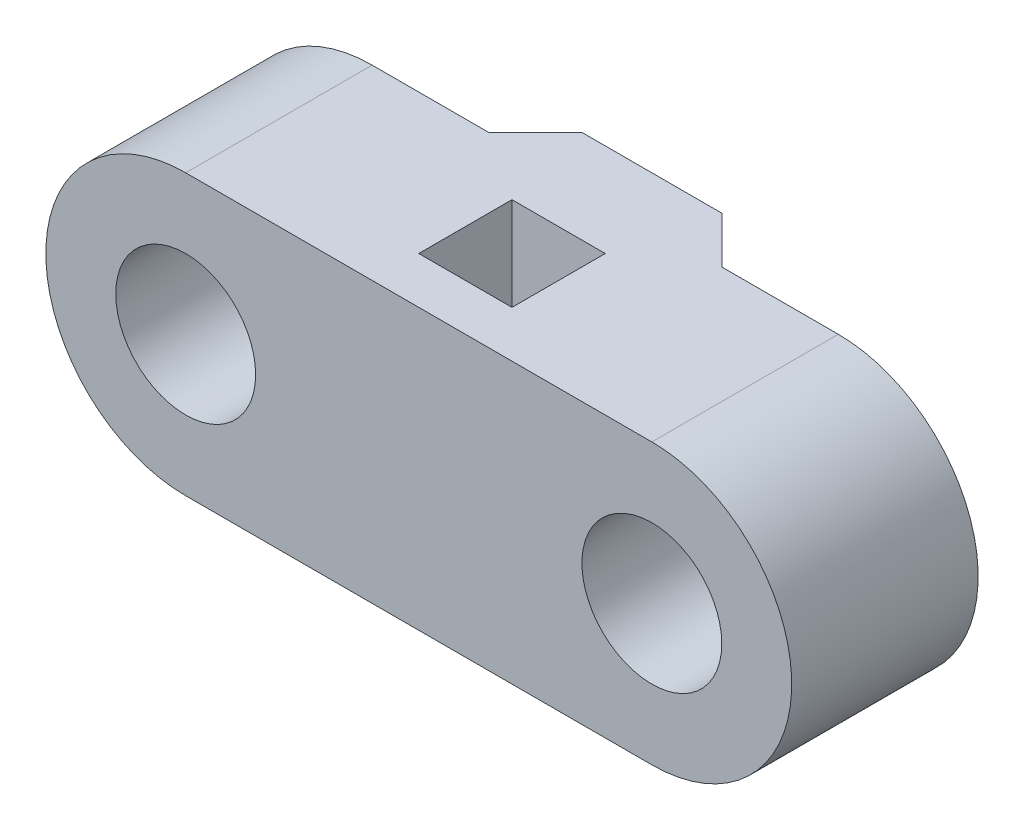
ISO-10303-21;
HEADER;
FILE_DESCRIPTION(('STEP AP214'),'2;1');
FILE_NAME('part.step','',(''),(''),'','','');
FILE_SCHEMA(('AUTOMOTIVE_DESIGN { 1 0 10303 214 1 1 1 1 }'));
ENDSEC;
DATA;
#1=APPLICATION_CONTEXT('core data for automotive mechanical design processes');
#2=APPLICATION_PROTOCOL_DEFINITION('international standard','automotive_design',2000,#1);
#3=PRODUCT_CONTEXT('',#1,'mechanical');
#4=PRODUCT('Part','Part','',(#3));
#5=PRODUCT_RELATED_PRODUCT_CATEGORY('part','',(#4));
#6=PRODUCT_DEFINITION_FORMATION('','',#4);
#7=PRODUCT_DEFINITION_CONTEXT('part definition',#1,'design');
#8=PRODUCT_DEFINITION('design','',#6,#7);
#9=PRODUCT_DEFINITION_SHAPE('','',#8);
#10=(LENGTH_UNIT() NAMED_UNIT(*) SI_UNIT(.MILLI.,.METRE.));
#11=(NAMED_UNIT(*) PLANE_ANGLE_UNIT() SI_UNIT($,.RADIAN.));
#12=(NAMED_UNIT(*) SI_UNIT($,.STERADIAN.) SOLID_ANGLE_UNIT());
#13=UNCERTAINTY_MEASURE_WITH_UNIT(LENGTH_MEASURE(1.E-05),#10,'distance_accuracy_value','');
#14=(GEOMETRIC_REPRESENTATION_CONTEXT(3) GLOBAL_UNCERTAINTY_ASSIGNED_CONTEXT((#13)) GLOBAL_UNIT_ASSIGNED_CONTEXT((#10,
#11,#12)) REPRESENTATION_CONTEXT('',''));
#15=CARTESIAN_POINT('',(0.,0.,0.));
#16=DIRECTION('',(0.,0.,1.));
#17=DIRECTION('',(1.,0.,0.));
#18=AXIS2_PLACEMENT_3D('',#15,#16,#17);
#19=CARTESIAN_POINT('',(0.,0.,0.));
#20=DIRECTION('',(0.,1.,0.));
#21=DIRECTION('',(0.,0.,1.));
#22=AXIS2_PLACEMENT_3D('',#19,#20,#21);
#23=PLANE('',#22);
#24=DIRECTION('',(0.,0.,1.));
#25=VECTOR('',#24,1.);
#26=CARTESIAN_POINT('',(-10.,0.,10.));
#27=LINE('',#26,#25);
#28=CARTESIAN_POINT('',(-10.,0.,-10.));
#29=VERTEX_POINT('',#28);
#30=CARTESIAN_POINT('',(-10.,0.,10.));
#31=VERTEX_POINT('',#30);
#32=EDGE_CURVE('E202',#29,#31,#27,.T.);
#33=ORIENTED_EDGE('',*,*,#32,.T.);
#34=DIRECTION('',(1.,0.,0.));
#35=VECTOR('',#34,1.);
#36=CARTESIAN_POINT('',(10.,0.,9.99999999999999));
#37=LINE('',#36,#35);
#38=CARTESIAN_POINT('',(10.,0.,9.99999999999999));
#39=VERTEX_POINT('',#38);
#40=EDGE_CURVE('E220',#31,#39,#37,.T.);
#41=ORIENTED_EDGE('',*,*,#40,.T.);
#42=DIRECTION('',(0.,0.,-1.));
#43=VECTOR('',#42,1.);
#44=CARTESIAN_POINT('',(10.,0.,9.99999999999999));
#45=LINE('',#44,#43);
#46=CARTESIAN_POINT('',(10.,0.,-10.));
#47=VERTEX_POINT('',#46);
#48=EDGE_CURVE('E223',#39,#47,#45,.T.);
#49=ORIENTED_EDGE('',*,*,#48,.T.);
#50=DIRECTION('',(-1.,0.,0.));
#51=VECTOR('',#50,1.);
#52=CARTESIAN_POINT('',(10.,0.,-10.));
#53=LINE('',#52,#51);
#54=EDGE_CURVE('E210',#47,#29,#53,.T.);
#55=ORIENTED_EDGE('',*,*,#54,.T.);
#56=EDGE_LOOP('',(#33,#41,#49,#55));
#57=FACE_BOUND('',#56,.T.);
#58=DIRECTION('',(0.,0.,1.));
#59=VECTOR('',#58,1.);
#60=CARTESIAN_POINT('',(50.,0.,-30.));
#61=LINE('',#60,#59);
#62=CARTESIAN_POINT('',(50.,0.,-20.));
#63=VERTEX_POINT('',#62);
#64=CARTESIAN_POINT('',(50.,0.,20.));
#65=VERTEX_POINT('',#64);
#66=EDGE_CURVE('E245',#63,#65,#61,.T.);
#67=ORIENTED_EDGE('',*,*,#66,.T.);
#68=DIRECTION('',(1.,0.,0.));
#69=VECTOR('',#68,1.);
#70=CARTESIAN_POINT('',(-80.,0.,20.));
#71=LINE('',#70,#69);
#72=CARTESIAN_POINT('',(-50.,0.,20.));
#73=VERTEX_POINT('',#72);
#74=EDGE_CURVE('E166',#73,#65,#71,.T.);
#75=ORIENTED_EDGE('',*,*,#74,.F.);
#76=DIRECTION('',(0.,0.,1.));
#77=VECTOR('',#76,1.);
#78=CARTESIAN_POINT('',(-50.,0.,-30.));
#79=LINE('',#78,#77);
#80=CARTESIAN_POINT('',(-50.,0.,-20.));
#81=VERTEX_POINT('',#80);
#82=EDGE_CURVE('E132',#81,#73,#79,.T.);
#83=ORIENTED_EDGE('',*,*,#82,.F.);
#84=DIRECTION('',(-1.,0.,0.));
#85=VECTOR('',#84,1.);
#86=CARTESIAN_POINT('',(-15.,0.,-20.));
#87=LINE('',#86,#85);
#88=CARTESIAN_POINT('',(-25.,0.,-20.));
#89=VERTEX_POINT('',#88);
#90=EDGE_CURVE('E163',#89,#81,#87,.T.);
#91=ORIENTED_EDGE('',*,*,#90,.F.);
#92=DIRECTION('',(-0.707106781186546,0.,0.707106781186549));
#93=VECTOR('',#92,1.);
#94=CARTESIAN_POINT('',(-22.5,0.,-22.4999999999999));
#95=LINE('',#94,#93);
#96=CARTESIAN_POINT('',(-15.,0.,-30.));
#97=VERTEX_POINT('',#96);
#98=EDGE_CURVE('E47',#89,#97,#95,.F.);
#99=ORIENTED_EDGE('',*,*,#98,.T.);
#100=DIRECTION('',(-1.,0.,0.));
#101=VECTOR('',#100,1.);
#102=CARTESIAN_POINT('',(-15.,0.,-30.));
#103=LINE('',#102,#101);
#104=CARTESIAN_POINT('',(15.,0.,-30.));
#105=VERTEX_POINT('',#104);
#106=EDGE_CURVE('E160',#105,#97,#103,.T.);
#107=ORIENTED_EDGE('',*,*,#106,.F.);
#108=DIRECTION('',(-0.707106781186547,0.,-0.707106781186549));
#109=VECTOR('',#108,1.);
#110=CARTESIAN_POINT('',(22.5,0.,-22.5));
#111=LINE('',#110,#109);
#112=CARTESIAN_POINT('',(25.,0.,-20.));
#113=VERTEX_POINT('',#112);
#114=EDGE_CURVE('E184',#105,#113,#111,.F.);
#115=ORIENTED_EDGE('',*,*,#114,.T.);
#116=DIRECTION('',(-1.,0.,0.));
#117=VECTOR('',#116,1.);
#118=CARTESIAN_POINT('',(15.,0.,-20.));
#119=LINE('',#118,#117);
#120=EDGE_CURVE('E168',#63,#113,#119,.T.);
#121=ORIENTED_EDGE('',*,*,#120,.F.);
#122=EDGE_LOOP('',(#67,#75,#83,#91,#99,#107,#115,#121));
#123=FACE_BOUND('',#122,.T.);
#124=ADVANCED_FACE('F38',(#57,#123),#23,.F.);
#125=CARTESIAN_POINT('',(-15.,60.,-20.));
#126=DIRECTION('',(0.,0.,1.));
#127=DIRECTION('',(1.,0.,0.));
#128=AXIS2_PLACEMENT_3D('',#125,#126,#127);
#129=PLANE('',#128);
#130=DIRECTION('',(-1.,0.,0.));
#131=VECTOR('',#130,1.);
#132=CARTESIAN_POINT('',(-15.,60.,-20.));
#133=LINE('',#132,#131);
#134=CARTESIAN_POINT('',(-25.,60.,-20.));
#135=VERTEX_POINT('',#134);
#136=CARTESIAN_POINT('',(-50.,60.,-20.));
#137=VERTEX_POINT('',#136);
#138=EDGE_CURVE('E145',#135,#137,#133,.T.);
#139=ORIENTED_EDGE('',*,*,#138,.F.);
#140=DIRECTION('',(0.,-1.,0.));
#141=VECTOR('',#140,1.);
#142=CARTESIAN_POINT('',(-25.,0.,-20.));
#143=LINE('',#142,#141);
#144=EDGE_CURVE('E182',#135,#89,#143,.T.);
#145=ORIENTED_EDGE('',*,*,#144,.T.);
#146=ORIENTED_EDGE('',*,*,#90,.T.);
#147=CARTESIAN_POINT('',(-50.,30.,-20.));
#148=DIRECTION('',(0.,0.,1.));
#149=DIRECTION('',(1.,0.,0.));
#150=AXIS2_PLACEMENT_3D('',#147,#148,#149);
#151=CIRCLE('',#150,30.);
#152=EDGE_CURVE('E178',#81,#137,#151,.F.);
#153=ORIENTED_EDGE('',*,*,#152,.T.);
#154=EDGE_LOOP('',(#139,#145,#146,#153));
#155=FACE_BOUND('',#154,.T.);
#156=CARTESIAN_POINT('',(-50.,30.,-20.));
#157=DIRECTION('',(0.,0.,1.));
#158=DIRECTION('',(1.,0.,0.));
#159=AXIS2_PLACEMENT_3D('',#156,#157,#158);
#160=CIRCLE('',#159,15.);
#161=CARTESIAN_POINT('',(-35.,30.,-20.));
#162=VERTEX_POINT('',#161);
#163=EDGE_CURVE('E199',#162,#162,#160,.T.);
#164=ORIENTED_EDGE('',*,*,#163,.T.);
#165=EDGE_LOOP('',(#164));
#166=FACE_BOUND('',#165,.T.);
#167=ADVANCED_FACE('F197',(#155,#166),#129,.F.);
#168=CARTESIAN_POINT('',(0.,60.,0.));
#169=DIRECTION('',(0.,1.,0.));
#170=DIRECTION('',(0.,0.,1.));
#171=AXIS2_PLACEMENT_3D('',#168,#169,#170);
#172=PLANE('',#171);
#173=DIRECTION('',(0.,0.,1.));
#174=VECTOR('',#173,1.);
#175=CARTESIAN_POINT('',(50.,60.,-30.));
#176=LINE('',#175,#174);
#177=CARTESIAN_POINT('',(50.,60.,-20.));
#178=VERTEX_POINT('',#177);
#179=CARTESIAN_POINT('',(50.,60.,20.));
#180=VERTEX_POINT('',#179);
#181=EDGE_CURVE('E248',#178,#180,#176,.T.);
#182=ORIENTED_EDGE('',*,*,#181,.F.);
#183=DIRECTION('',(-1.,0.,0.));
#184=VECTOR('',#183,1.);
#185=CARTESIAN_POINT('',(15.,60.,-20.));
#186=LINE('',#185,#184);
#187=CARTESIAN_POINT('',(25.,60.,-20.));
#188=VERTEX_POINT('',#187);
#189=EDGE_CURVE('E151',#178,#188,#186,.T.);
#190=ORIENTED_EDGE('',*,*,#189,.T.);
#191=DIRECTION('',(0.707106781186547,0.,0.707106781186549));
#192=VECTOR('',#191,1.);
#193=CARTESIAN_POINT('',(15.,60.,-30.));
#194=LINE('',#193,#192);
#195=CARTESIAN_POINT('',(15.,60.,-30.));
#196=VERTEX_POINT('',#195);
#197=EDGE_CURVE('E186',#188,#196,#194,.F.);
#198=ORIENTED_EDGE('',*,*,#197,.T.);
#199=DIRECTION('',(-1.,0.,0.));
#200=VECTOR('',#199,1.);
#201=CARTESIAN_POINT('',(-15.,60.,-30.));
#202=LINE('',#201,#200);
#203=CARTESIAN_POINT('',(-15.,60.,-30.));
#204=VERTEX_POINT('',#203);
#205=EDGE_CURVE('E156',#196,#204,#202,.T.);
#206=ORIENTED_EDGE('',*,*,#205,.T.);
#207=DIRECTION('',(0.707106781186546,0.,-0.707106781186549));
#208=VECTOR('',#207,1.);
#209=CARTESIAN_POINT('',(-25.,60.,-20.));
#210=LINE('',#209,#208);
#211=EDGE_CURVE('E11',#204,#135,#210,.F.);
#212=ORIENTED_EDGE('',*,*,#211,.T.);
#213=ORIENTED_EDGE('',*,*,#138,.T.);
#214=DIRECTION('',(0.,0.,1.));
#215=VECTOR('',#214,1.);
#216=CARTESIAN_POINT('',(-50.,60.,-30.));
#217=LINE('',#216,#215);
#218=CARTESIAN_POINT('',(-50.,60.,20.));
#219=VERTEX_POINT('',#218);
#220=EDGE_CURVE('E130',#137,#219,#217,.T.);
#221=ORIENTED_EDGE('',*,*,#220,.T.);
#222=DIRECTION('',(1.,0.,0.));
#223=VECTOR('',#222,1.);
#224=CARTESIAN_POINT('',(-80.,60.,20.));
#225=LINE('',#224,#223);
#226=EDGE_CURVE('E144',#219,#180,#225,.T.);
#227=ORIENTED_EDGE('',*,*,#226,.T.);
#228=EDGE_LOOP('',(#182,#190,#198,#206,#212,#213,#221,#227));
#229=FACE_BOUND('',#228,.T.);
#230=DIRECTION('',(1.,0.,0.));
#231=VECTOR('',#230,1.);
#232=CARTESIAN_POINT('',(10.,60.,9.99999999999999));
#233=LINE('',#232,#231);
#234=CARTESIAN_POINT('',(-10.,60.,10.));
#235=VERTEX_POINT('',#234);
#236=CARTESIAN_POINT('',(10.,60.,9.99999999999999));
#237=VERTEX_POINT('',#236);
#238=EDGE_CURVE('E209',#235,#237,#233,.T.);
#239=ORIENTED_EDGE('',*,*,#238,.F.);
#240=DIRECTION('',(0.,0.,1.));
#241=VECTOR('',#240,1.);
#242=CARTESIAN_POINT('',(-10.,60.,10.));
#243=LINE('',#242,#241);
#244=CARTESIAN_POINT('',(-10.,60.,-10.));
#245=VERTEX_POINT('',#244);
#246=EDGE_CURVE('E207',#245,#235,#243,.T.);
#247=ORIENTED_EDGE('',*,*,#246,.F.);
#248=DIRECTION('',(-1.,0.,0.));
#249=VECTOR('',#248,1.);
#250=CARTESIAN_POINT('',(10.,60.,-10.));
#251=LINE('',#250,#249);
#252=CARTESIAN_POINT('',(10.,60.,-10.));
#253=VERTEX_POINT('',#252);
#254=EDGE_CURVE('E215',#253,#245,#251,.T.);
#255=ORIENTED_EDGE('',*,*,#254,.F.);
#256=DIRECTION('',(0.,0.,-1.));
#257=VECTOR('',#256,1.);
#258=CARTESIAN_POINT('',(10.,60.,9.99999999999999));
#259=LINE('',#258,#257);
#260=EDGE_CURVE('E212',#237,#253,#259,.T.);
#261=ORIENTED_EDGE('',*,*,#260,.F.);
#262=EDGE_LOOP('',(#239,#247,#255,#261));
#263=FACE_BOUND('',#262,.T.);
#264=ADVANCED_FACE('F142',(#229,#263),#172,.T.);
#265=CARTESIAN_POINT('',(-15.,60.,-30.));
#266=DIRECTION('',(0.,0.,1.));
#267=DIRECTION('',(1.,0.,0.));
#268=AXIS2_PLACEMENT_3D('',#265,#266,#267);
#269=PLANE('',#268);
#270=ORIENTED_EDGE('',*,*,#106,.T.);
#271=DIRECTION('',(0.,-1.,0.));
#272=VECTOR('',#271,1.);
#273=CARTESIAN_POINT('',(-15.,60.,-30.));
#274=LINE('',#273,#272);
#275=EDGE_CURVE('E154',#204,#97,#274,.T.);
#276=ORIENTED_EDGE('',*,*,#275,.F.);
#277=ORIENTED_EDGE('',*,*,#205,.F.);
#278=DIRECTION('',(0.,-1.,0.));
#279=VECTOR('',#278,1.);
#280=CARTESIAN_POINT('',(15.,60.,-30.));
#281=LINE('',#280,#279);
#282=EDGE_CURVE('E172',#196,#105,#281,.T.);
#283=ORIENTED_EDGE('',*,*,#282,.T.);
#284=EDGE_LOOP('',(#270,#276,#277,#283));
#285=FACE_BOUND('',#284,.T.);
#286=ADVANCED_FACE('F193',(#285),#269,.F.);
#287=CARTESIAN_POINT('',(-80.,60.,20.));
#288=DIRECTION('',(0.,0.,-1.));
#289=DIRECTION('',(-1.,0.,0.));
#290=AXIS2_PLACEMENT_3D('',#287,#288,#289);
#291=PLANE('',#290);
#292=CARTESIAN_POINT('',(-50.,30.,20.));
#293=DIRECTION('',(0.,0.,1.));
#294=DIRECTION('',(-1.,0.,0.));
#295=AXIS2_PLACEMENT_3D('',#292,#293,#294);
#296=CIRCLE('',#295,15.);
#297=CARTESIAN_POINT('',(-65.,30.,20.));
#298=VERTEX_POINT('',#297);
#299=EDGE_CURVE('E247',#298,#298,#296,.T.);
#300=ORIENTED_EDGE('',*,*,#299,.F.);
#301=EDGE_LOOP('',(#300));
#302=FACE_BOUND('',#301,.T.);
#303=CARTESIAN_POINT('',(50.,30.,20.));
#304=DIRECTION('',(0.,0.,1.));
#305=DIRECTION('',(1.,0.,0.));
#306=AXIS2_PLACEMENT_3D('',#303,#304,#305);
#307=CIRCLE('',#306,15.);
#308=CARTESIAN_POINT('',(65.,30.,20.));
#309=VERTEX_POINT('',#308);
#310=EDGE_CURVE('E179',#309,#309,#307,.T.);
#311=ORIENTED_EDGE('',*,*,#310,.F.);
#312=EDGE_LOOP('',(#311));
#313=FACE_BOUND('',#312,.T.);
#314=ORIENTED_EDGE('',*,*,#74,.T.);
#315=CARTESIAN_POINT('',(50.,30.,20.));
#316=DIRECTION('',(0.,0.,-1.));
#317=DIRECTION('',(-1.,0.,0.));
#318=AXIS2_PLACEMENT_3D('',#315,#316,#317);
#319=CIRCLE('',#318,30.);
#320=EDGE_CURVE('E149',#180,#65,#319,.T.);
#321=ORIENTED_EDGE('',*,*,#320,.F.);
#322=ORIENTED_EDGE('',*,*,#226,.F.);
#323=CARTESIAN_POINT('',(-50.,30.,20.));
#324=DIRECTION('',(0.,0.,-1.));
#325=DIRECTION('',(-1.,0.,0.));
#326=AXIS2_PLACEMENT_3D('',#323,#324,#325);
#327=CIRCLE('',#326,30.);
#328=EDGE_CURVE('E126',#219,#73,#327,.F.);
#329=ORIENTED_EDGE('',*,*,#328,.T.);
#330=EDGE_LOOP('',(#314,#321,#322,#329));
#331=FACE_BOUND('',#330,.T.);
#332=ADVANCED_FACE('F148',(#302,#313,#331),#291,.F.);
#333=CARTESIAN_POINT('',(15.,60.,-20.));
#334=DIRECTION('',(0.,0.,1.));
#335=DIRECTION('',(1.,0.,0.));
#336=AXIS2_PLACEMENT_3D('',#333,#334,#335);
#337=PLANE('',#336);
#338=CARTESIAN_POINT('',(50.,30.,-20.));
#339=DIRECTION('',(0.,0.,1.));
#340=DIRECTION('',(1.,0.,0.));
#341=AXIS2_PLACEMENT_3D('',#338,#339,#340);
#342=CIRCLE('',#341,15.);
#343=CARTESIAN_POINT('',(65.,30.,-20.));
#344=VERTEX_POINT('',#343);
#345=EDGE_CURVE('E175',#344,#344,#342,.T.);
#346=ORIENTED_EDGE('',*,*,#345,.T.);
#347=EDGE_LOOP('',(#346));
#348=FACE_BOUND('',#347,.T.);
#349=ORIENTED_EDGE('',*,*,#120,.T.);
#350=DIRECTION('',(0.,1.,0.));
#351=VECTOR('',#350,1.);
#352=CARTESIAN_POINT('',(25.,60.,-20.));
#353=LINE('',#352,#351);
#354=EDGE_CURVE('E137',#113,#188,#353,.T.);
#355=ORIENTED_EDGE('',*,*,#354,.T.);
#356=ORIENTED_EDGE('',*,*,#189,.F.);
#357=CARTESIAN_POINT('',(50.,30.,-20.));
#358=DIRECTION('',(0.,0.,1.));
#359=DIRECTION('',(1.,0.,0.));
#360=AXIS2_PLACEMENT_3D('',#357,#358,#359);
#361=CIRCLE('',#360,30.);
#362=EDGE_CURVE('E138',#178,#63,#361,.F.);
#363=ORIENTED_EDGE('',*,*,#362,.T.);
#364=EDGE_LOOP('',(#349,#355,#356,#363));
#365=FACE_BOUND('',#364,.T.);
#366=ADVANCED_FACE('F241',(#348,#365),#337,.F.);
#367=CARTESIAN_POINT('',(-10.,60.,10.));
#368=DIRECTION('',(1.,0.,0.));
#369=DIRECTION('',(0.,0.,-1.));
#370=AXIS2_PLACEMENT_3D('',#367,#368,#369);
#371=PLANE('',#370);
#372=ORIENTED_EDGE('',*,*,#32,.F.);
#373=DIRECTION('',(0.,-1.,0.));
#374=VECTOR('',#373,1.);
#375=CARTESIAN_POINT('',(-10.,60.,-10.));
#376=LINE('',#375,#374);
#377=EDGE_CURVE('E217',#245,#29,#376,.T.);
#378=ORIENTED_EDGE('',*,*,#377,.F.);
#379=ORIENTED_EDGE('',*,*,#246,.T.);
#380=DIRECTION('',(0.,-1.,0.));
#381=VECTOR('',#380,1.);
#382=CARTESIAN_POINT('',(-10.,60.,10.));
#383=LINE('',#382,#381);
#384=EDGE_CURVE('E164',#235,#31,#383,.T.);
#385=ORIENTED_EDGE('',*,*,#384,.T.);
#386=EDGE_LOOP('',(#372,#378,#379,#385));
#387=FACE_BOUND('',#386,.T.);
#388=ADVANCED_FACE('F269',(#387),#371,.T.);
#389=CARTESIAN_POINT('',(10.,60.,9.99999999999999));
#390=DIRECTION('',(0.,0.,-1.));
#391=DIRECTION('',(-1.,0.,0.));
#392=AXIS2_PLACEMENT_3D('',#389,#390,#391);
#393=PLANE('',#392);
#394=ORIENTED_EDGE('',*,*,#40,.F.);
#395=ORIENTED_EDGE('',*,*,#384,.F.);
#396=ORIENTED_EDGE('',*,*,#238,.T.);
#397=DIRECTION('',(0.,-1.,0.));
#398=VECTOR('',#397,1.);
#399=CARTESIAN_POINT('',(10.,60.,9.99999999999999));
#400=LINE('',#399,#398);
#401=EDGE_CURVE('E232',#237,#39,#400,.T.);
#402=ORIENTED_EDGE('',*,*,#401,.T.);
#403=EDGE_LOOP('',(#394,#395,#396,#402));
#404=FACE_BOUND('',#403,.T.);
#405=ADVANCED_FACE('F285',(#404),#393,.T.);
#406=CARTESIAN_POINT('',(10.,60.,9.99999999999999));
#407=DIRECTION('',(-1.,0.,0.));
#408=DIRECTION('',(0.,0.,1.));
#409=AXIS2_PLACEMENT_3D('',#406,#407,#408);
#410=PLANE('',#409);
#411=ORIENTED_EDGE('',*,*,#48,.F.);
#412=ORIENTED_EDGE('',*,*,#401,.F.);
#413=ORIENTED_EDGE('',*,*,#260,.T.);
#414=DIRECTION('',(0.,-1.,0.));
#415=VECTOR('',#414,1.);
#416=CARTESIAN_POINT('',(10.,60.,-10.));
#417=LINE('',#416,#415);
#418=EDGE_CURVE('E230',#253,#47,#417,.T.);
#419=ORIENTED_EDGE('',*,*,#418,.T.);
#420=EDGE_LOOP('',(#411,#412,#413,#419));
#421=FACE_BOUND('',#420,.T.);
#422=ADVANCED_FACE('F289',(#421),#410,.T.);
#423=CARTESIAN_POINT('',(10.,60.,-10.));
#424=DIRECTION('',(0.,0.,1.));
#425=DIRECTION('',(1.,0.,0.));
#426=AXIS2_PLACEMENT_3D('',#423,#424,#425);
#427=PLANE('',#426);
#428=ORIENTED_EDGE('',*,*,#54,.F.);
#429=ORIENTED_EDGE('',*,*,#418,.F.);
#430=ORIENTED_EDGE('',*,*,#254,.T.);
#431=ORIENTED_EDGE('',*,*,#377,.T.);
#432=EDGE_LOOP('',(#428,#429,#430,#431));
#433=FACE_BOUND('',#432,.T.);
#434=ADVANCED_FACE('F293',(#433),#427,.T.);
#435=CARTESIAN_POINT('',(50.,30.,-30.));
#436=DIRECTION('',(0.,0.,1.));
#437=DIRECTION('',(1.,0.,0.));
#438=AXIS2_PLACEMENT_3D('',#435,#436,#437);
#439=CYLINDRICAL_SURFACE('',#438,15.);
#440=ORIENTED_EDGE('',*,*,#310,.T.);
#441=EDGE_LOOP('',(#440));
#442=FACE_BOUND('',#441,.T.);
#443=ORIENTED_EDGE('',*,*,#345,.F.);
#444=EDGE_LOOP('',(#443));
#445=FACE_BOUND('',#444,.T.);
#446=ADVANCED_FACE('F259',(#442,#445),#439,.F.);
#447=CARTESIAN_POINT('',(50.,30.,-30.));
#448=DIRECTION('',(0.,0.,1.));
#449=DIRECTION('',(1.,0.,0.));
#450=AXIS2_PLACEMENT_3D('',#447,#448,#449);
#451=CYLINDRICAL_SURFACE('',#450,30.);
#452=ORIENTED_EDGE('',*,*,#320,.T.);
#453=ORIENTED_EDGE('',*,*,#66,.F.);
#454=ORIENTED_EDGE('',*,*,#362,.F.);
#455=ORIENTED_EDGE('',*,*,#181,.T.);
#456=EDGE_LOOP('',(#452,#453,#454,#455));
#457=FACE_BOUND('',#456,.T.);
#458=ADVANCED_FACE('F246',(#457),#451,.T.);
#459=CARTESIAN_POINT('',(-50.,30.,-30.));
#460=DIRECTION('',(0.,0.,1.));
#461=DIRECTION('',(1.,0.,0.));
#462=AXIS2_PLACEMENT_3D('',#459,#460,#461);
#463=CYLINDRICAL_SURFACE('',#462,30.);
#464=ORIENTED_EDGE('',*,*,#82,.T.);
#465=ORIENTED_EDGE('',*,*,#328,.F.);
#466=ORIENTED_EDGE('',*,*,#220,.F.);
#467=ORIENTED_EDGE('',*,*,#152,.F.);
#468=EDGE_LOOP('',(#464,#465,#466,#467));
#469=FACE_BOUND('',#468,.T.);
#470=ADVANCED_FACE('F128',(#469),#463,.T.);
#471=CARTESIAN_POINT('',(-50.,30.,-30.));
#472=DIRECTION('',(0.,0.,1.));
#473=DIRECTION('',(1.,0.,0.));
#474=AXIS2_PLACEMENT_3D('',#471,#472,#473);
#475=CYLINDRICAL_SURFACE('',#474,15.);
#476=ORIENTED_EDGE('',*,*,#299,.T.);
#477=EDGE_LOOP('',(#476));
#478=FACE_BOUND('',#477,.T.);
#479=ORIENTED_EDGE('',*,*,#163,.F.);
#480=EDGE_LOOP('',(#479));
#481=FACE_BOUND('',#480,.T.);
#482=ADVANCED_FACE('F302',(#478,#481),#475,.F.);
#483=CARTESIAN_POINT('',(15.,60.,-30.));
#484=DIRECTION('',(0.707106781186548,0.,-0.707106781186546));
#485=DIRECTION('',(0.,1.,0.));
#486=AXIS2_PLACEMENT_3D('',#483,#484,#485);
#487=PLANE('',#486);
#488=ORIENTED_EDGE('',*,*,#197,.F.);
#489=ORIENTED_EDGE('',*,*,#354,.F.);
#490=ORIENTED_EDGE('',*,*,#114,.F.);
#491=ORIENTED_EDGE('',*,*,#282,.F.);
#492=EDGE_LOOP('',(#488,#489,#490,#491));
#493=FACE_BOUND('',#492,.T.);
#494=ADVANCED_FACE('F237',(#493),#487,.T.);
#495=CARTESIAN_POINT('',(-25.,60.,-20.));
#496=DIRECTION('',(-0.707106781186549,0.,-0.707106781186546));
#497=DIRECTION('',(0.,1.,0.));
#498=AXIS2_PLACEMENT_3D('',#495,#496,#497);
#499=PLANE('',#498);
#500=ORIENTED_EDGE('',*,*,#211,.F.);
#501=ORIENTED_EDGE('',*,*,#275,.T.);
#502=ORIENTED_EDGE('',*,*,#98,.F.);
#503=ORIENTED_EDGE('',*,*,#144,.F.);
#504=EDGE_LOOP('',(#500,#501,#502,#503));
#505=FACE_BOUND('',#504,.T.);
#506=ADVANCED_FACE('F41',(#505),#499,.T.);
#507=CLOSED_SHELL('',(#124,#167,#264,#286,#332,#366,#388,#405,#422,#434,#446,#458,#470,#482,
#494,#506));
#508=MANIFOLD_SOLID_BREP('B2',#507);
#509=ADVANCED_BREP_SHAPE_REPRESENTATION('',(#18,#508),#14);
#510=SHAPE_DEFINITION_REPRESENTATION(#9,#509);
ENDSEC;
END-ISO-10303-21;
